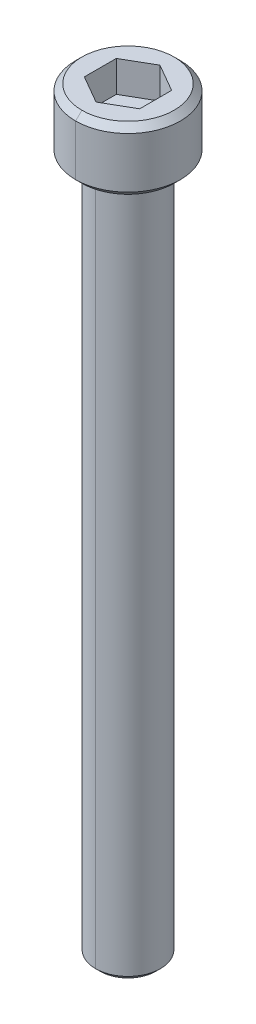
ISO-10303-21;
HEADER;
FILE_DESCRIPTION(('STEP AP214'),'2;1');
FILE_NAME('part.step','',(''),(''),'','','');
FILE_SCHEMA(('AUTOMOTIVE_DESIGN { 1 0 10303 214 1 1 1 1 }'));
ENDSEC;
DATA;
#1=APPLICATION_CONTEXT('core data for automotive mechanical design processes');
#2=APPLICATION_PROTOCOL_DEFINITION('international standard','automotive_design',2000,#1);
#3=PRODUCT_CONTEXT('',#1,'mechanical');
#4=PRODUCT('Part','Part','',(#3));
#5=PRODUCT_RELATED_PRODUCT_CATEGORY('part','',(#4));
#6=PRODUCT_DEFINITION_FORMATION('','',#4);
#7=PRODUCT_DEFINITION_CONTEXT('part definition',#1,'design');
#8=PRODUCT_DEFINITION('design','',#6,#7);
#9=PRODUCT_DEFINITION_SHAPE('','',#8);
#10=(LENGTH_UNIT() NAMED_UNIT(*) SI_UNIT(.MILLI.,.METRE.));
#11=(NAMED_UNIT(*) PLANE_ANGLE_UNIT() SI_UNIT($,.RADIAN.));
#12=(NAMED_UNIT(*) SI_UNIT($,.STERADIAN.) SOLID_ANGLE_UNIT());
#13=UNCERTAINTY_MEASURE_WITH_UNIT(LENGTH_MEASURE(1.E-05),#10,'distance_accuracy_value','');
#14=(GEOMETRIC_REPRESENTATION_CONTEXT(3) GLOBAL_UNCERTAINTY_ASSIGNED_CONTEXT((#13)) GLOBAL_UNIT_ASSIGNED_CONTEXT((#10,
#11,#12)) REPRESENTATION_CONTEXT('',''));
#15=CARTESIAN_POINT('',(0.,0.,0.));
#16=DIRECTION('',(0.,0.,1.));
#17=DIRECTION('',(1.,0.,0.));
#18=AXIS2_PLACEMENT_3D('',#15,#16,#17);
#19=CARTESIAN_POINT('',(0.,-44.15,0.));
#20=DIRECTION('',(0.,1.,0.));
#21=DIRECTION('',(0.,0.,1.));
#22=AXIS2_PLACEMENT_3D('',#19,#20,#21);
#23=CONICAL_SURFACE('',#22,2.0828,0.785398163397443);
#24=DIRECTION('',(0.,0.707106781186551,-0.707106781186544));
#25=VECTOR('',#24,1.);
#26=CARTESIAN_POINT('',(0.,-44.15,-2.0828));
#27=LINE('',#26,#25);
#28=CARTESIAN_POINT('',(0.,-44.45,-1.7828));
#29=VERTEX_POINT('',#28);
#30=CARTESIAN_POINT('',(0.,-44.15,-2.0828));
#31=VERTEX_POINT('',#30);
#32=EDGE_CURVE('E222',#29,#31,#27,.T.);
#33=ORIENTED_EDGE('',*,*,#32,.F.);
#34=CARTESIAN_POINT('',(0.,-44.45,0.));
#35=DIRECTION('',(0.,-1.,0.));
#36=DIRECTION('',(0.,0.,1.));
#37=AXIS2_PLACEMENT_3D('',#34,#35,#36);
#38=CIRCLE('',#37,1.7828);
#39=CARTESIAN_POINT('',(0.,-44.45,1.7828));
#40=VERTEX_POINT('',#39);
#41=EDGE_CURVE('E213',#40,#29,#38,.T.);
#42=ORIENTED_EDGE('',*,*,#41,.F.);
#43=DIRECTION('',(0.,0.707106781186551,0.707106781186544));
#44=VECTOR('',#43,1.);
#45=CARTESIAN_POINT('',(0.,-44.15,2.0828));
#46=LINE('',#45,#44);
#47=CARTESIAN_POINT('',(0.,-44.15,2.0828));
#48=VERTEX_POINT('',#47);
#49=EDGE_CURVE('E243',#40,#48,#46,.T.);
#50=ORIENTED_EDGE('',*,*,#49,.T.);
#51=CARTESIAN_POINT('',(0.,-44.15,0.));
#52=DIRECTION('',(0.,1.,0.));
#53=DIRECTION('',(0.,0.,1.));
#54=AXIS2_PLACEMENT_3D('',#51,#52,#53);
#55=CIRCLE('',#54,2.0828);
#56=EDGE_CURVE('E229',#31,#48,#55,.T.);
#57=ORIENTED_EDGE('',*,*,#56,.F.);
#58=EDGE_LOOP('',(#33,#42,#50,#57));
#59=FACE_BOUND('',#58,.T.);
#60=ADVANCED_FACE('F16',(#59),#23,.T.);
#61=CARTESIAN_POINT('',(0.,0.4,0.));
#62=DIRECTION('',(0.,1.,0.));
#63=DIRECTION('',(0.,0.,1.));
#64=AXIS2_PLACEMENT_3D('',#61,#62,#63);
#65=CONICAL_SURFACE('',#64,3.3655,0.785398163397455);
#66=DIRECTION('',(0.,0.707106781186543,-0.707106781186552));
#67=VECTOR('',#66,1.);
#68=CARTESIAN_POINT('',(0.,0.4,-3.3655));
#69=LINE('',#68,#67);
#70=CARTESIAN_POINT('',(0.,0.,-2.9655));
#71=VERTEX_POINT('',#70);
#72=CARTESIAN_POINT('',(0.,0.4,-3.3655));
#73=VERTEX_POINT('',#72);
#74=EDGE_CURVE('E188',#71,#73,#69,.T.);
#75=ORIENTED_EDGE('',*,*,#74,.F.);
#76=CARTESIAN_POINT('',(0.,0.,0.));
#77=DIRECTION('',(0.,-1.,0.));
#78=DIRECTION('',(0.,0.,1.));
#79=AXIS2_PLACEMENT_3D('',#76,#77,#78);
#80=CIRCLE('',#79,2.9655);
#81=CARTESIAN_POINT('',(0.,0.,2.9655));
#82=VERTEX_POINT('',#81);
#83=EDGE_CURVE('E180',#82,#71,#80,.T.);
#84=ORIENTED_EDGE('',*,*,#83,.F.);
#85=DIRECTION('',(0.,0.707106781186543,0.707106781186552));
#86=VECTOR('',#85,1.);
#87=CARTESIAN_POINT('',(0.,0.4,3.3655));
#88=LINE('',#87,#86);
#89=CARTESIAN_POINT('',(0.,0.4,3.3655));
#90=VERTEX_POINT('',#89);
#91=EDGE_CURVE('E178',#82,#90,#88,.T.);
#92=ORIENTED_EDGE('',*,*,#91,.T.);
#93=CARTESIAN_POINT('',(0.,0.4,0.));
#94=DIRECTION('',(0.,1.,0.));
#95=DIRECTION('',(0.,0.,1.));
#96=AXIS2_PLACEMENT_3D('',#93,#94,#95);
#97=CIRCLE('',#96,3.3655);
#98=EDGE_CURVE('E150',#73,#90,#97,.T.);
#99=ORIENTED_EDGE('',*,*,#98,.F.);
#100=EDGE_LOOP('',(#75,#84,#92,#99));
#101=FACE_BOUND('',#100,.T.);
#102=ADVANCED_FACE('F179',(#101),#65,.T.);
#103=CARTESIAN_POINT('',(0.,4.064,0.));
#104=DIRECTION('',(0.,-1.,0.));
#105=DIRECTION('',(0.,0.,-1.));
#106=AXIS2_PLACEMENT_3D('',#103,#104,#105);
#107=CONICAL_SURFACE('',#106,2.9655,0.785398163397443);
#108=DIRECTION('',(0.,-0.707106781186551,0.707106781186545));
#109=VECTOR('',#108,1.);
#110=CARTESIAN_POINT('',(0.,4.064,2.9655));
#111=LINE('',#110,#109);
#112=CARTESIAN_POINT('',(0.,4.064,2.9655));
#113=VERTEX_POINT('',#112);
#114=CARTESIAN_POINT('',(0.,3.664,3.3655));
#115=VERTEX_POINT('',#114);
#116=EDGE_CURVE('E247',#113,#115,#111,.T.);
#117=ORIENTED_EDGE('',*,*,#116,.F.);
#118=CARTESIAN_POINT('',(0.,4.064,0.));
#119=DIRECTION('',(0.,1.,0.));
#120=DIRECTION('',(0.,0.,1.));
#121=AXIS2_PLACEMENT_3D('',#118,#119,#120);
#122=CIRCLE('',#121,2.9655);
#123=CARTESIAN_POINT('',(0.,4.064,-2.9655));
#124=VERTEX_POINT('',#123);
#125=EDGE_CURVE('E163',#124,#113,#122,.T.);
#126=ORIENTED_EDGE('',*,*,#125,.F.);
#127=DIRECTION('',(0.,-0.707106781186551,-0.707106781186545));
#128=VECTOR('',#127,1.);
#129=CARTESIAN_POINT('',(0.,4.064,-2.9655));
#130=LINE('',#129,#128);
#131=CARTESIAN_POINT('',(0.,3.664,-3.3655));
#132=VERTEX_POINT('',#131);
#133=EDGE_CURVE('E175',#124,#132,#130,.T.);
#134=ORIENTED_EDGE('',*,*,#133,.T.);
#135=CARTESIAN_POINT('',(0.,3.664,0.));
#136=DIRECTION('',(0.,-1.,0.));
#137=DIRECTION('',(0.,0.,1.));
#138=AXIS2_PLACEMENT_3D('',#135,#136,#137);
#139=CIRCLE('',#138,3.3655);
#140=EDGE_CURVE('E164',#115,#132,#139,.T.);
#141=ORIENTED_EDGE('',*,*,#140,.F.);
#142=EDGE_LOOP('',(#117,#126,#134,#141));
#143=FACE_BOUND('',#142,.T.);
#144=ADVANCED_FACE('F411',(#143),#107,.T.);
#145=CARTESIAN_POINT('',(1.778,2.064,3.07958633585746));
#146=DIRECTION('',(0.,1.,0.));
#147=DIRECTION('',(1.,0.,0.));
#148=AXIS2_PLACEMENT_3D('',#145,#146,#147);
#149=PLANE('',#148);
#150=DIRECTION('',(0.866025403784439,0.,0.5));
#151=VECTOR('',#150,1.);
#152=CARTESIAN_POINT('',(-1.778,2.064,1.02652877861915));
#153=LINE('',#152,#151);
#154=CARTESIAN_POINT('',(-1.778,2.064,1.02652877861915));
#155=VERTEX_POINT('',#154);
#156=CARTESIAN_POINT('',(0.,2.064,2.05305755723831));
#157=VERTEX_POINT('',#156);
#158=EDGE_CURVE('E236',#155,#157,#153,.T.);
#159=ORIENTED_EDGE('',*,*,#158,.T.);
#160=DIRECTION('',(0.866025403784438,0.,-0.5));
#161=VECTOR('',#160,1.);
#162=CARTESIAN_POINT('',(0.,2.064,2.05305755723831));
#163=LINE('',#162,#161);
#164=CARTESIAN_POINT('',(1.778,2.064,1.02652877861915));
#165=VERTEX_POINT('',#164);
#166=EDGE_CURVE('E11',#157,#165,#163,.T.);
#167=ORIENTED_EDGE('',*,*,#166,.T.);
#168=DIRECTION('',(0.,0.,-1.));
#169=VECTOR('',#168,1.);
#170=CARTESIAN_POINT('',(1.778,2.064,1.02652877861915));
#171=LINE('',#170,#169);
#172=CARTESIAN_POINT('',(1.778,2.064,-1.02652877861916));
#173=VERTEX_POINT('',#172);
#174=EDGE_CURVE('E293',#165,#173,#171,.T.);
#175=ORIENTED_EDGE('',*,*,#174,.T.);
#176=DIRECTION('',(-0.866025403784439,0.,-0.5));
#177=VECTOR('',#176,1.);
#178=CARTESIAN_POINT('',(1.778,2.064,-1.02652877861916));
#179=LINE('',#178,#177);
#180=CARTESIAN_POINT('',(0.,2.064,-2.05305755723831));
#181=VERTEX_POINT('',#180);
#182=EDGE_CURVE('E225',#173,#181,#179,.T.);
#183=ORIENTED_EDGE('',*,*,#182,.T.);
#184=DIRECTION('',(-0.866025403784439,0.,0.5));
#185=VECTOR('',#184,1.);
#186=CARTESIAN_POINT('',(0.,2.064,-2.05305755723831));
#187=LINE('',#186,#185);
#188=CARTESIAN_POINT('',(-1.778,2.064,-1.02652877861915));
#189=VERTEX_POINT('',#188);
#190=EDGE_CURVE('E214',#181,#189,#187,.T.);
#191=ORIENTED_EDGE('',*,*,#190,.T.);
#192=DIRECTION('',(0.,0.,1.));
#193=VECTOR('',#192,1.);
#194=CARTESIAN_POINT('',(-1.778,2.064,-1.02652877861915));
#195=LINE('',#194,#193);
#196=EDGE_CURVE('E616',#189,#155,#195,.T.);
#197=ORIENTED_EDGE('',*,*,#196,.T.);
#198=EDGE_LOOP('',(#159,#167,#175,#183,#191,#197));
#199=FACE_BOUND('',#198,.T.);
#200=ADVANCED_FACE('F394',(#199),#149,.T.);
#201=CARTESIAN_POINT('',(0.,2.064,2.05305755723831));
#202=DIRECTION('',(0.5,0.,0.866025403784438));
#203=DIRECTION('',(0.,-1.,0.));
#204=AXIS2_PLACEMENT_3D('',#201,#202,#203);
#205=PLANE('',#204);
#206=DIRECTION('',(0.866025403784438,0.,-0.5));
#207=VECTOR('',#206,1.);
#208=CARTESIAN_POINT('',(0.,4.064,2.05305755723831));
#209=LINE('',#208,#207);
#210=CARTESIAN_POINT('',(0.,4.064,2.05305755723831));
#211=VERTEX_POINT('',#210);
#212=CARTESIAN_POINT('',(1.778,4.064,1.02652877861915));
#213=VERTEX_POINT('',#212);
#214=EDGE_CURVE('E204',#211,#213,#209,.T.);
#215=ORIENTED_EDGE('',*,*,#214,.T.);
#216=DIRECTION('',(0.,1.,0.));
#217=VECTOR('',#216,1.);
#218=CARTESIAN_POINT('',(1.778,2.064,1.02652877861915));
#219=LINE('',#218,#217);
#220=EDGE_CURVE('E27',#165,#213,#219,.T.);
#221=ORIENTED_EDGE('',*,*,#220,.F.);
#222=ORIENTED_EDGE('',*,*,#166,.F.);
#223=DIRECTION('',(0.,1.,0.));
#224=VECTOR('',#223,1.);
#225=CARTESIAN_POINT('',(0.,2.064,2.05305755723831));
#226=LINE('',#225,#224);
#227=EDGE_CURVE('E240',#157,#211,#226,.T.);
#228=ORIENTED_EDGE('',*,*,#227,.T.);
#229=EDGE_LOOP('',(#215,#221,#222,#228));
#230=FACE_BOUND('',#229,.T.);
#231=ADVANCED_FACE('F389',(#230),#205,.F.);
#232=CARTESIAN_POINT('',(1.778,2.064,1.02652877861915));
#233=DIRECTION('',(1.,0.,0.));
#234=DIRECTION('',(0.,0.,-1.));
#235=AXIS2_PLACEMENT_3D('',#232,#233,#234);
#236=PLANE('',#235);
#237=DIRECTION('',(0.,0.,-1.));
#238=VECTOR('',#237,1.);
#239=CARTESIAN_POINT('',(1.778,4.064,1.02652877861915));
#240=LINE('',#239,#238);
#241=CARTESIAN_POINT('',(1.778,4.064,-1.02652877861916));
#242=VERTEX_POINT('',#241);
#243=EDGE_CURVE('E201',#213,#242,#240,.T.);
#244=ORIENTED_EDGE('',*,*,#243,.T.);
#245=DIRECTION('',(0.,1.,0.));
#246=VECTOR('',#245,1.);
#247=CARTESIAN_POINT('',(1.778,2.064,-1.02652877861916));
#248=LINE('',#247,#246);
#249=EDGE_CURVE('E20',#173,#242,#248,.T.);
#250=ORIENTED_EDGE('',*,*,#249,.F.);
#251=ORIENTED_EDGE('',*,*,#174,.F.);
#252=ORIENTED_EDGE('',*,*,#220,.T.);
#253=EDGE_LOOP('',(#244,#250,#251,#252));
#254=FACE_BOUND('',#253,.T.);
#255=ADVANCED_FACE('F393',(#254),#236,.F.);
#256=CARTESIAN_POINT('',(1.778,2.064,-1.02652877861916));
#257=DIRECTION('',(0.5,0.,-0.866025403784439));
#258=DIRECTION('',(0.,-1.,0.));
#259=AXIS2_PLACEMENT_3D('',#256,#257,#258);
#260=PLANE('',#259);
#261=DIRECTION('',(-0.866025403784439,0.,-0.5));
#262=VECTOR('',#261,1.);
#263=CARTESIAN_POINT('',(1.778,4.064,-1.02652877861916));
#264=LINE('',#263,#262);
#265=CARTESIAN_POINT('',(0.,4.064,-2.05305755723831));
#266=VERTEX_POINT('',#265);
#267=EDGE_CURVE('E205',#242,#266,#264,.T.);
#268=ORIENTED_EDGE('',*,*,#267,.T.);
#269=DIRECTION('',(0.,1.,0.));
#270=VECTOR('',#269,1.);
#271=CARTESIAN_POINT('',(0.,2.064,-2.05305755723831));
#272=LINE('',#271,#270);
#273=EDGE_CURVE('E140',#181,#266,#272,.T.);
#274=ORIENTED_EDGE('',*,*,#273,.F.);
#275=ORIENTED_EDGE('',*,*,#182,.F.);
#276=ORIENTED_EDGE('',*,*,#249,.T.);
#277=EDGE_LOOP('',(#268,#274,#275,#276));
#278=FACE_BOUND('',#277,.T.);
#279=ADVANCED_FACE('F421',(#278),#260,.F.);
#280=CARTESIAN_POINT('',(0.,2.064,-2.05305755723831));
#281=DIRECTION('',(-0.5,0.,-0.866025403784439));
#282=DIRECTION('',(-0.866025403784439,0.,0.5));
#283=AXIS2_PLACEMENT_3D('',#280,#281,#282);
#284=PLANE('',#283);
#285=DIRECTION('',(-0.866025403784439,0.,0.5));
#286=VECTOR('',#285,1.);
#287=CARTESIAN_POINT('',(0.,4.064,-2.05305755723831));
#288=LINE('',#287,#286);
#289=CARTESIAN_POINT('',(-1.778,4.064,-1.02652877861915));
#290=VERTEX_POINT('',#289);
#291=EDGE_CURVE('E230',#266,#290,#288,.T.);
#292=ORIENTED_EDGE('',*,*,#291,.T.);
#293=DIRECTION('',(0.,1.,0.));
#294=VECTOR('',#293,1.);
#295=CARTESIAN_POINT('',(-1.778,2.064,-1.02652877861915));
#296=LINE('',#295,#294);
#297=EDGE_CURVE('E217',#189,#290,#296,.T.);
#298=ORIENTED_EDGE('',*,*,#297,.F.);
#299=ORIENTED_EDGE('',*,*,#190,.F.);
#300=ORIENTED_EDGE('',*,*,#273,.T.);
#301=EDGE_LOOP('',(#292,#298,#299,#300));
#302=FACE_BOUND('',#301,.T.);
#303=ADVANCED_FACE('F416',(#302),#284,.F.);
#304=CARTESIAN_POINT('',(-1.778,2.064,-1.02652877861915));
#305=DIRECTION('',(-1.,0.,0.));
#306=DIRECTION('',(0.,1.,0.));
#307=AXIS2_PLACEMENT_3D('',#304,#305,#306);
#308=PLANE('',#307);
#309=DIRECTION('',(0.,0.,1.));
#310=VECTOR('',#309,1.);
#311=CARTESIAN_POINT('',(-1.778,4.064,-1.02652877861915));
#312=LINE('',#311,#310);
#313=CARTESIAN_POINT('',(-1.778,4.064,1.02652877861915));
#314=VERTEX_POINT('',#313);
#315=EDGE_CURVE('E233',#290,#314,#312,.T.);
#316=ORIENTED_EDGE('',*,*,#315,.T.);
#317=DIRECTION('',(0.,1.,0.));
#318=VECTOR('',#317,1.);
#319=CARTESIAN_POINT('',(-1.778,2.064,1.02652877861915));
#320=LINE('',#319,#318);
#321=EDGE_CURVE('E239',#155,#314,#320,.T.);
#322=ORIENTED_EDGE('',*,*,#321,.F.);
#323=ORIENTED_EDGE('',*,*,#196,.F.);
#324=ORIENTED_EDGE('',*,*,#297,.T.);
#325=EDGE_LOOP('',(#316,#322,#323,#324));
#326=FACE_BOUND('',#325,.T.);
#327=ADVANCED_FACE('F420',(#326),#308,.F.);
#328=CARTESIAN_POINT('',(-1.778,2.064,1.02652877861915));
#329=DIRECTION('',(-0.5,0.,0.866025403784439));
#330=DIRECTION('',(0.,1.,0.));
#331=AXIS2_PLACEMENT_3D('',#328,#329,#330);
#332=PLANE('',#331);
#333=DIRECTION('',(0.866025403784439,0.,0.5));
#334=VECTOR('',#333,1.);
#335=CARTESIAN_POINT('',(-1.778,4.064,1.02652877861915));
#336=LINE('',#335,#334);
#337=EDGE_CURVE('E200',#314,#211,#336,.T.);
#338=ORIENTED_EDGE('',*,*,#337,.T.);
#339=ORIENTED_EDGE('',*,*,#227,.F.);
#340=ORIENTED_EDGE('',*,*,#158,.F.);
#341=ORIENTED_EDGE('',*,*,#321,.T.);
#342=EDGE_LOOP('',(#338,#339,#340,#341));
#343=FACE_BOUND('',#342,.T.);
#344=ADVANCED_FACE('F18',(#343),#332,.F.);
#345=CARTESIAN_POINT('',(0.,0.,0.));
#346=DIRECTION('',(0.,1.,0.));
#347=DIRECTION('',(1.,0.,0.));
#348=AXIS2_PLACEMENT_3D('',#345,#346,#347);
#349=PLANE('',#348);
#350=CARTESIAN_POINT('',(0.,0.,0.));
#351=DIRECTION('',(0.,1.,0.));
#352=DIRECTION('',(0.,0.,1.));
#353=AXIS2_PLACEMENT_3D('',#350,#351,#352);
#354=CIRCLE('',#353,2.0828);
#355=CARTESIAN_POINT('',(0.,0.,2.0828));
#356=VERTEX_POINT('',#355);
#357=CARTESIAN_POINT('',(0.,0.,-2.0828));
#358=VERTEX_POINT('',#357);
#359=EDGE_CURVE('E210',#356,#358,#354,.T.);
#360=ORIENTED_EDGE('',*,*,#359,.T.);
#361=CARTESIAN_POINT('',(0.,0.,0.));
#362=DIRECTION('',(0.,1.,0.));
#363=DIRECTION('',(0.,0.,1.));
#364=AXIS2_PLACEMENT_3D('',#361,#362,#363);
#365=CIRCLE('',#364,2.0828);
#366=EDGE_CURVE('E226',#358,#356,#365,.T.);
#367=ORIENTED_EDGE('',*,*,#366,.T.);
#368=EDGE_LOOP('',(#360,#367));
#369=FACE_BOUND('',#368,.T.);
#370=ORIENTED_EDGE('',*,*,#83,.T.);
#371=CARTESIAN_POINT('',(0.,0.,0.));
#372=DIRECTION('',(0.,-1.,0.));
#373=DIRECTION('',(0.,0.,1.));
#374=AXIS2_PLACEMENT_3D('',#371,#372,#373);
#375=CIRCLE('',#374,2.9655);
#376=EDGE_CURVE('E195',#71,#82,#375,.T.);
#377=ORIENTED_EDGE('',*,*,#376,.T.);
#378=EDGE_LOOP('',(#370,#377));
#379=FACE_BOUND('',#378,.T.);
#380=ADVANCED_FACE('F437',(#369,#379),#349,.F.);
#381=CARTESIAN_POINT('',(0.,4.064,0.));
#382=DIRECTION('',(0.,1.,0.));
#383=DIRECTION('',(1.,0.,0.));
#384=AXIS2_PLACEMENT_3D('',#381,#382,#383);
#385=PLANE('',#384);
#386=ORIENTED_EDGE('',*,*,#337,.F.);
#387=ORIENTED_EDGE('',*,*,#315,.F.);
#388=ORIENTED_EDGE('',*,*,#291,.F.);
#389=ORIENTED_EDGE('',*,*,#267,.F.);
#390=ORIENTED_EDGE('',*,*,#243,.F.);
#391=ORIENTED_EDGE('',*,*,#214,.F.);
#392=EDGE_LOOP('',(#386,#387,#388,#389,#390,#391));
#393=FACE_BOUND('',#392,.T.);
#394=ORIENTED_EDGE('',*,*,#125,.T.);
#395=CARTESIAN_POINT('',(0.,4.064,0.));
#396=DIRECTION('',(0.,1.,0.));
#397=DIRECTION('',(0.,0.,1.));
#398=AXIS2_PLACEMENT_3D('',#395,#396,#397);
#399=CIRCLE('',#398,2.9655);
#400=EDGE_CURVE('E185',#113,#124,#399,.T.);
#401=ORIENTED_EDGE('',*,*,#400,.T.);
#402=EDGE_LOOP('',(#394,#401));
#403=FACE_BOUND('',#402,.T.);
#404=ADVANCED_FACE('F433',(#393,#403),#385,.T.);
#405=CARTESIAN_POINT('',(0.,4.064,0.));
#406=DIRECTION('',(0.,-1.,0.));
#407=DIRECTION('',(0.,0.,-1.));
#408=AXIS2_PLACEMENT_3D('',#405,#406,#407);
#409=CYLINDRICAL_SURFACE('',#408,3.3655);
#410=DIRECTION('',(0.,-1.,0.));
#411=VECTOR('',#410,1.);
#412=CARTESIAN_POINT('',(0.,4.064,3.3655));
#413=LINE('',#412,#411);
#414=EDGE_CURVE('E154',#115,#90,#413,.T.);
#415=ORIENTED_EDGE('',*,*,#414,.F.);
#416=ORIENTED_EDGE('',*,*,#140,.T.);
#417=DIRECTION('',(0.,-1.,0.));
#418=VECTOR('',#417,1.);
#419=CARTESIAN_POINT('',(0.,4.064,-3.3655));
#420=LINE('',#419,#418);
#421=EDGE_CURVE('E157',#132,#73,#420,.T.);
#422=ORIENTED_EDGE('',*,*,#421,.T.);
#423=ORIENTED_EDGE('',*,*,#98,.T.);
#424=EDGE_LOOP('',(#415,#416,#422,#423));
#425=FACE_BOUND('',#424,.T.);
#426=ADVANCED_FACE('F152',(#425),#409,.T.);
#427=CARTESIAN_POINT('',(0.,-44.45,0.));
#428=DIRECTION('',(0.,1.,0.));
#429=DIRECTION('',(1.,0.,0.));
#430=AXIS2_PLACEMENT_3D('',#427,#428,#429);
#431=PLANE('',#430);
#432=ORIENTED_EDGE('',*,*,#41,.T.);
#433=CARTESIAN_POINT('',(0.,-44.45,0.));
#434=DIRECTION('',(0.,-1.,0.));
#435=DIRECTION('',(0.,0.,1.));
#436=AXIS2_PLACEMENT_3D('',#433,#434,#435);
#437=CIRCLE('',#436,1.7828);
#438=EDGE_CURVE('E218',#29,#40,#437,.T.);
#439=ORIENTED_EDGE('',*,*,#438,.T.);
#440=EDGE_LOOP('',(#432,#439));
#441=FACE_BOUND('',#440,.T.);
#442=ADVANCED_FACE('F465',(#441),#431,.F.);
#443=CARTESIAN_POINT('',(0.,-44.45,0.));
#444=DIRECTION('',(0.,1.,0.));
#445=DIRECTION('',(0.,0.,1.));
#446=AXIS2_PLACEMENT_3D('',#443,#444,#445);
#447=CYLINDRICAL_SURFACE('',#446,2.0828);
#448=DIRECTION('',(0.,1.,0.));
#449=VECTOR('',#448,1.);
#450=CARTESIAN_POINT('',(0.,-44.45,-2.0828));
#451=LINE('',#450,#449);
#452=EDGE_CURVE('E206',#31,#358,#451,.T.);
#453=ORIENTED_EDGE('',*,*,#452,.F.);
#454=ORIENTED_EDGE('',*,*,#56,.T.);
#455=DIRECTION('',(0.,1.,0.));
#456=VECTOR('',#455,1.);
#457=CARTESIAN_POINT('',(0.,-44.45,2.0828));
#458=LINE('',#457,#456);
#459=EDGE_CURVE('E248',#48,#356,#458,.T.);
#460=ORIENTED_EDGE('',*,*,#459,.T.);
#461=ORIENTED_EDGE('',*,*,#366,.F.);
#462=EDGE_LOOP('',(#453,#454,#460,#461));
#463=FACE_BOUND('',#462,.T.);
#464=ADVANCED_FACE('F383',(#463),#447,.T.);
#465=CARTESIAN_POINT('',(0.,-44.45,0.));
#466=DIRECTION('',(0.,1.,0.));
#467=DIRECTION('',(0.,0.,1.));
#468=AXIS2_PLACEMENT_3D('',#465,#466,#467);
#469=CYLINDRICAL_SURFACE('',#468,2.0828);
#470=CARTESIAN_POINT('',(0.,-44.15,0.));
#471=DIRECTION('',(0.,1.,0.));
#472=DIRECTION('',(0.,0.,1.));
#473=AXIS2_PLACEMENT_3D('',#470,#471,#472);
#474=CIRCLE('',#473,2.0828);
#475=EDGE_CURVE('E275',#48,#31,#474,.T.);
#476=ORIENTED_EDGE('',*,*,#475,.T.);
#477=ORIENTED_EDGE('',*,*,#452,.T.);
#478=ORIENTED_EDGE('',*,*,#359,.F.);
#479=ORIENTED_EDGE('',*,*,#459,.F.);
#480=EDGE_LOOP('',(#476,#477,#478,#479));
#481=FACE_BOUND('',#480,.T.);
#482=ADVANCED_FACE('F375',(#481),#469,.T.);
#483=CARTESIAN_POINT('',(0.,4.064,0.));
#484=DIRECTION('',(0.,-1.,0.));
#485=DIRECTION('',(0.,0.,-1.));
#486=AXIS2_PLACEMENT_3D('',#483,#484,#485);
#487=CYLINDRICAL_SURFACE('',#486,3.3655);
#488=CARTESIAN_POINT('',(0.,3.664,0.));
#489=DIRECTION('',(0.,-1.,0.));
#490=DIRECTION('',(0.,0.,1.));
#491=AXIS2_PLACEMENT_3D('',#488,#489,#490);
#492=CIRCLE('',#491,3.3655);
#493=EDGE_CURVE('E172',#132,#115,#492,.T.);
#494=ORIENTED_EDGE('',*,*,#493,.T.);
#495=ORIENTED_EDGE('',*,*,#414,.T.);
#496=CARTESIAN_POINT('',(0.,0.4,0.));
#497=DIRECTION('',(0.,1.,0.));
#498=DIRECTION('',(0.,0.,1.));
#499=AXIS2_PLACEMENT_3D('',#496,#497,#498);
#500=CIRCLE('',#499,3.3655);
#501=EDGE_CURVE('E169',#90,#73,#500,.T.);
#502=ORIENTED_EDGE('',*,*,#501,.T.);
#503=ORIENTED_EDGE('',*,*,#421,.F.);
#504=EDGE_LOOP('',(#494,#495,#502,#503));
#505=FACE_BOUND('',#504,.T.);
#506=ADVANCED_FACE('F167',(#505),#487,.T.);
#507=CARTESIAN_POINT('',(0.,4.064,0.));
#508=DIRECTION('',(0.,-1.,0.));
#509=DIRECTION('',(0.,0.,-1.));
#510=AXIS2_PLACEMENT_3D('',#507,#508,#509);
#511=CONICAL_SURFACE('',#510,2.9655,0.785398163397443);
#512=ORIENTED_EDGE('',*,*,#400,.F.);
#513=ORIENTED_EDGE('',*,*,#116,.T.);
#514=ORIENTED_EDGE('',*,*,#493,.F.);
#515=ORIENTED_EDGE('',*,*,#133,.F.);
#516=EDGE_LOOP('',(#512,#513,#514,#515));
#517=FACE_BOUND('',#516,.T.);
#518=ADVANCED_FACE('F374',(#517),#511,.T.);
#519=CARTESIAN_POINT('',(0.,0.4,0.));
#520=DIRECTION('',(0.,1.,0.));
#521=DIRECTION('',(0.,0.,1.));
#522=AXIS2_PLACEMENT_3D('',#519,#520,#521);
#523=CONICAL_SURFACE('',#522,3.3655,0.785398163397455);
#524=ORIENTED_EDGE('',*,*,#376,.F.);
#525=ORIENTED_EDGE('',*,*,#74,.T.);
#526=ORIENTED_EDGE('',*,*,#501,.F.);
#527=ORIENTED_EDGE('',*,*,#91,.F.);
#528=EDGE_LOOP('',(#524,#525,#526,#527));
#529=FACE_BOUND('',#528,.T.);
#530=ADVANCED_FACE('F187',(#529),#523,.T.);
#531=CARTESIAN_POINT('',(0.,-44.15,0.));
#532=DIRECTION('',(0.,1.,0.));
#533=DIRECTION('',(0.,0.,1.));
#534=AXIS2_PLACEMENT_3D('',#531,#532,#533);
#535=CONICAL_SURFACE('',#534,2.0828,0.785398163397443);
#536=ORIENTED_EDGE('',*,*,#438,.F.);
#537=ORIENTED_EDGE('',*,*,#32,.T.);
#538=ORIENTED_EDGE('',*,*,#475,.F.);
#539=ORIENTED_EDGE('',*,*,#49,.F.);
#540=EDGE_LOOP('',(#536,#537,#538,#539));
#541=FACE_BOUND('',#540,.T.);
#542=ADVANCED_FACE('F482',(#541),#535,.T.);
#543=CLOSED_SHELL('',(#60,#102,#144,#200,#231,#255,#279,#303,#327,#344,#380,#404,#426,#442,#464,
#482,#506,#518,#530,#542));
#544=MANIFOLD_SOLID_BREP('B1',#543);
#545=ADVANCED_BREP_SHAPE_REPRESENTATION('',(#18,#544),#14);
#546=SHAPE_DEFINITION_REPRESENTATION(#9,#545);
ENDSEC;
END-ISO-10303-21;
